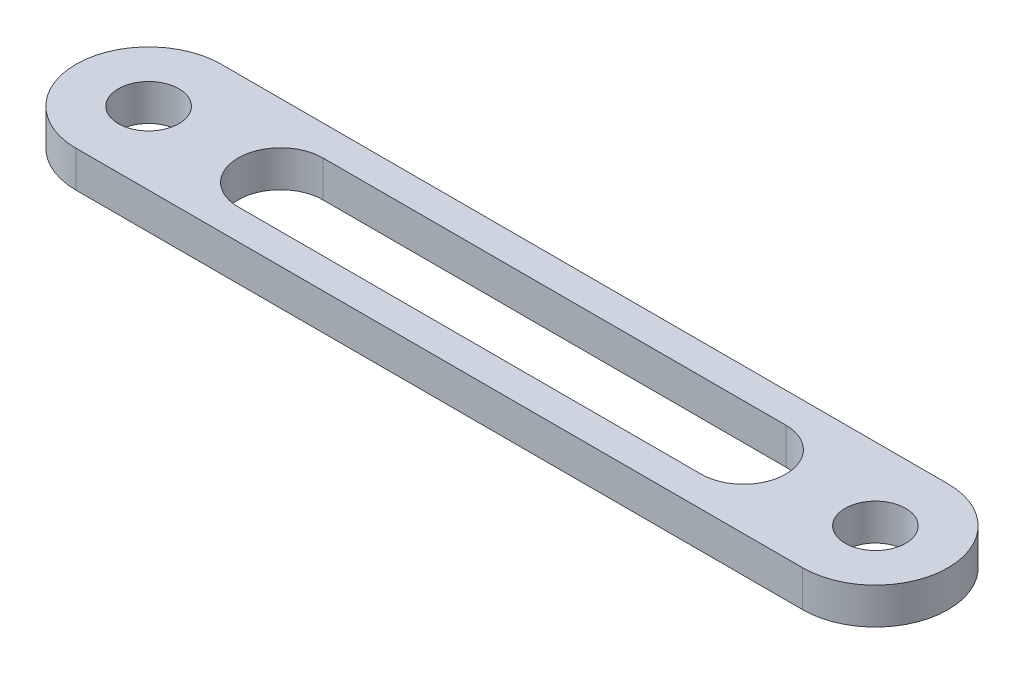
ISO-10303-21;
HEADER;
FILE_DESCRIPTION(('STEP AP214'),'2;1');
FILE_NAME('part.step','',(''),(''),'','','');
FILE_SCHEMA(('AUTOMOTIVE_DESIGN { 1 0 10303 214 1 1 1 1 }'));
ENDSEC;
DATA;
#1=APPLICATION_CONTEXT('core data for automotive mechanical design processes');
#2=APPLICATION_PROTOCOL_DEFINITION('international standard','automotive_design',2000,#1);
#3=PRODUCT_CONTEXT('',#1,'mechanical');
#4=PRODUCT('Part','Part','',(#3));
#5=PRODUCT_RELATED_PRODUCT_CATEGORY('part','',(#4));
#6=PRODUCT_DEFINITION_FORMATION('','',#4);
#7=PRODUCT_DEFINITION_CONTEXT('part definition',#1,'design');
#8=PRODUCT_DEFINITION('design','',#6,#7);
#9=PRODUCT_DEFINITION_SHAPE('','',#8);
#10=(LENGTH_UNIT() NAMED_UNIT(*) SI_UNIT(.MILLI.,.METRE.));
#11=(NAMED_UNIT(*) PLANE_ANGLE_UNIT() SI_UNIT($,.RADIAN.));
#12=(NAMED_UNIT(*) SI_UNIT($,.STERADIAN.) SOLID_ANGLE_UNIT());
#13=UNCERTAINTY_MEASURE_WITH_UNIT(LENGTH_MEASURE(1.E-05),#10,'distance_accuracy_value','');
#14=(GEOMETRIC_REPRESENTATION_CONTEXT(3) GLOBAL_UNCERTAINTY_ASSIGNED_CONTEXT((#13)) GLOBAL_UNIT_ASSIGNED_CONTEXT((#10,
#11,#12)) REPRESENTATION_CONTEXT('',''));
#15=CARTESIAN_POINT('',(0.,0.,0.));
#16=DIRECTION('',(0.,0.,1.));
#17=DIRECTION('',(1.,0.,0.));
#18=AXIS2_PLACEMENT_3D('',#15,#16,#17);
#19=CARTESIAN_POINT('',(38.1,3.81,0.));
#20=DIRECTION('',(0.,1.,0.));
#21=DIRECTION('',(0.,0.,1.));
#22=AXIS2_PLACEMENT_3D('',#19,#20,#21);
#23=PLANE('',#22);
#24=CARTESIAN_POINT('',(-38.1,3.81,0.));
#25=DIRECTION('',(0.,1.,0.));
#26=DIRECTION('',(0.,0.,1.));
#27=AXIS2_PLACEMENT_3D('',#24,#25,#26);
#28=CIRCLE('',#27,3.175);
#29=CARTESIAN_POINT('',(-38.1,3.81,-3.17499999999999));
#30=VERTEX_POINT('',#29);
#31=EDGE_CURVE('E170',#30,#30,#28,.T.);
#32=ORIENTED_EDGE('',*,*,#31,.F.);
#33=EDGE_LOOP('',(#32));
#34=FACE_BOUND('',#33,.T.);
#35=CARTESIAN_POINT('',(38.1,3.81,0.));
#36=DIRECTION('',(0.,1.,0.));
#37=DIRECTION('',(0.,0.,1.));
#38=AXIS2_PLACEMENT_3D('',#35,#36,#37);
#39=CIRCLE('',#38,7.62);
#40=CARTESIAN_POINT('',(38.1,3.81,7.61999999999998));
#41=VERTEX_POINT('',#40);
#42=CARTESIAN_POINT('',(38.1,3.81,-7.62000000000002));
#43=VERTEX_POINT('',#42);
#44=EDGE_CURVE('E174',#41,#43,#39,.T.);
#45=ORIENTED_EDGE('',*,*,#44,.T.);
#46=DIRECTION('',(-1.,0.,0.));
#47=VECTOR('',#46,1.);
#48=CARTESIAN_POINT('',(38.1,3.81,-7.62000000000002));
#49=LINE('',#48,#47);
#50=CARTESIAN_POINT('',(-38.1,3.81,-7.61999999999999));
#51=VERTEX_POINT('',#50);
#52=EDGE_CURVE('E177',#43,#51,#49,.T.);
#53=ORIENTED_EDGE('',*,*,#52,.T.);
#54=CARTESIAN_POINT('',(-38.1,3.81,0.));
#55=DIRECTION('',(0.,1.,0.));
#56=DIRECTION('',(0.,0.,1.));
#57=AXIS2_PLACEMENT_3D('',#54,#55,#56);
#58=CIRCLE('',#57,7.62);
#59=CARTESIAN_POINT('',(-38.1,3.81,7.62000000000001));
#60=VERTEX_POINT('',#59);
#61=EDGE_CURVE('E182',#51,#60,#58,.T.);
#62=ORIENTED_EDGE('',*,*,#61,.T.);
#63=DIRECTION('',(1.,0.,0.));
#64=VECTOR('',#63,1.);
#65=CARTESIAN_POINT('',(38.1,3.81,7.61999999999998));
#66=LINE('',#65,#64);
#67=EDGE_CURVE('E187',#60,#41,#66,.T.);
#68=ORIENTED_EDGE('',*,*,#67,.T.);
#69=EDGE_LOOP('',(#45,#53,#62,#68));
#70=FACE_BOUND('',#69,.T.);
#71=CARTESIAN_POINT('',(38.1,3.81,0.));
#72=DIRECTION('',(0.,1.,0.));
#73=DIRECTION('',(0.,0.,1.));
#74=AXIS2_PLACEMENT_3D('',#71,#72,#73);
#75=CIRCLE('',#74,3.175);
#76=CARTESIAN_POINT('',(38.1,3.81,-3.17500000000001));
#77=VERTEX_POINT('',#76);
#78=EDGE_CURVE('E158',#77,#77,#75,.T.);
#79=ORIENTED_EDGE('',*,*,#78,.F.);
#80=EDGE_LOOP('',(#79));
#81=FACE_BOUND('',#80,.T.);
#82=DIRECTION('',(1.,0.,0.));
#83=VECTOR('',#82,1.);
#84=CARTESIAN_POINT('',(-24.2668538232179,3.81,4.44500000000001));
#85=LINE('',#84,#83);
#86=CARTESIAN_POINT('',(-24.2668538232179,3.81,4.44500000000001));
#87=VERTEX_POINT('',#86);
#88=CARTESIAN_POINT('',(24.2668538232179,3.81,4.44499999999999));
#89=VERTEX_POINT('',#88);
#90=EDGE_CURVE('E119',#87,#89,#85,.T.);
#91=ORIENTED_EDGE('',*,*,#90,.F.);
#92=CARTESIAN_POINT('',(-24.2668538232179,3.81,0.));
#93=DIRECTION('',(0.,1.,0.));
#94=DIRECTION('',(0.,0.,1.));
#95=AXIS2_PLACEMENT_3D('',#92,#93,#94);
#96=CIRCLE('',#95,4.445);
#97=CARTESIAN_POINT('',(-24.2668538232179,3.81,-4.44499999999999));
#98=VERTEX_POINT('',#97);
#99=EDGE_CURVE('E111',#98,#87,#96,.T.);
#100=ORIENTED_EDGE('',*,*,#99,.F.);
#101=DIRECTION('',(-1.,0.,0.));
#102=VECTOR('',#101,1.);
#103=CARTESIAN_POINT('',(-24.2668538232179,3.81,-4.44499999999999));
#104=LINE('',#103,#102);
#105=CARTESIAN_POINT('',(24.2668538232179,3.81,-4.44500000000001));
#106=VERTEX_POINT('',#105);
#107=EDGE_CURVE('E140',#106,#98,#104,.T.);
#108=ORIENTED_EDGE('',*,*,#107,.F.);
#109=CARTESIAN_POINT('',(24.2668538232179,3.81,0.));
#110=DIRECTION('',(0.,1.,0.));
#111=DIRECTION('',(0.,0.,1.));
#112=AXIS2_PLACEMENT_3D('',#109,#110,#111);
#113=CIRCLE('',#112,4.445);
#114=EDGE_CURVE('E132',#89,#106,#113,.T.);
#115=ORIENTED_EDGE('',*,*,#114,.F.);
#116=EDGE_LOOP('',(#91,#100,#108,#115));
#117=FACE_BOUND('',#116,.T.);
#118=ADVANCED_FACE('F44',(#34,#70,#81,#117),#23,.T.);
#119=CARTESIAN_POINT('',(38.1,0.,0.));
#120=DIRECTION('',(0.,1.,0.));
#121=DIRECTION('',(0.,0.,1.));
#122=AXIS2_PLACEMENT_3D('',#119,#120,#121);
#123=PLANE('',#122);
#124=CARTESIAN_POINT('',(38.1,0.,0.));
#125=DIRECTION('',(0.,1.,0.));
#126=DIRECTION('',(0.,0.,1.));
#127=AXIS2_PLACEMENT_3D('',#124,#125,#126);
#128=CIRCLE('',#127,3.175);
#129=CARTESIAN_POINT('',(38.1,0.,-3.17500000000001));
#130=VERTEX_POINT('',#129);
#131=EDGE_CURVE('E126',#130,#130,#128,.T.);
#132=ORIENTED_EDGE('',*,*,#131,.T.);
#133=EDGE_LOOP('',(#132));
#134=FACE_BOUND('',#133,.T.);
#135=CARTESIAN_POINT('',(-38.1,0.,0.));
#136=DIRECTION('',(0.,1.,0.));
#137=DIRECTION('',(0.,0.,1.));
#138=AXIS2_PLACEMENT_3D('',#135,#136,#137);
#139=CIRCLE('',#138,3.175);
#140=CARTESIAN_POINT('',(-38.1,0.,-3.17499999999999));
#141=VERTEX_POINT('',#140);
#142=EDGE_CURVE('E161',#141,#141,#139,.T.);
#143=ORIENTED_EDGE('',*,*,#142,.T.);
#144=EDGE_LOOP('',(#143));
#145=FACE_BOUND('',#144,.T.);
#146=CARTESIAN_POINT('',(38.1,0.,0.));
#147=DIRECTION('',(0.,1.,0.));
#148=DIRECTION('',(0.,0.,1.));
#149=AXIS2_PLACEMENT_3D('',#146,#147,#148);
#150=CIRCLE('',#149,7.62);
#151=CARTESIAN_POINT('',(38.1,0.,7.61999999999998));
#152=VERTEX_POINT('',#151);
#153=CARTESIAN_POINT('',(38.1,0.,-7.62000000000002));
#154=VERTEX_POINT('',#153);
#155=EDGE_CURVE('E171',#152,#154,#150,.T.);
#156=ORIENTED_EDGE('',*,*,#155,.F.);
#157=DIRECTION('',(1.,0.,0.));
#158=VECTOR('',#157,1.);
#159=CARTESIAN_POINT('',(38.1,0.,7.61999999999998));
#160=LINE('',#159,#158);
#161=CARTESIAN_POINT('',(-38.1,0.,7.62000000000001));
#162=VERTEX_POINT('',#161);
#163=EDGE_CURVE('E179',#162,#152,#160,.T.);
#164=ORIENTED_EDGE('',*,*,#163,.F.);
#165=CARTESIAN_POINT('',(-38.1,0.,0.));
#166=DIRECTION('',(0.,1.,0.));
#167=DIRECTION('',(0.,0.,1.));
#168=AXIS2_PLACEMENT_3D('',#165,#166,#167);
#169=CIRCLE('',#168,7.62);
#170=CARTESIAN_POINT('',(-38.1,0.,-7.61999999999999));
#171=VERTEX_POINT('',#170);
#172=EDGE_CURVE('E198',#171,#162,#169,.T.);
#173=ORIENTED_EDGE('',*,*,#172,.F.);
#174=DIRECTION('',(-1.,0.,0.));
#175=VECTOR('',#174,1.);
#176=CARTESIAN_POINT('',(38.1,0.,-7.62000000000002));
#177=LINE('',#176,#175);
#178=EDGE_CURVE('E194',#154,#171,#177,.T.);
#179=ORIENTED_EDGE('',*,*,#178,.F.);
#180=EDGE_LOOP('',(#156,#164,#173,#179));
#181=FACE_BOUND('',#180,.T.);
#182=CARTESIAN_POINT('',(-24.2668538232179,0.,0.));
#183=DIRECTION('',(0.,1.,0.));
#184=DIRECTION('',(0.,0.,1.));
#185=AXIS2_PLACEMENT_3D('',#182,#183,#184);
#186=CIRCLE('',#185,4.445);
#187=CARTESIAN_POINT('',(-24.2668538232179,0.,-4.44499999999999));
#188=VERTEX_POINT('',#187);
#189=CARTESIAN_POINT('',(-24.2668538232179,0.,4.44500000000001));
#190=VERTEX_POINT('',#189);
#191=EDGE_CURVE('E70',#188,#190,#186,.T.);
#192=ORIENTED_EDGE('',*,*,#191,.T.);
#193=DIRECTION('',(1.,0.,0.));
#194=VECTOR('',#193,1.);
#195=CARTESIAN_POINT('',(-24.2668538232179,0.,4.44500000000001));
#196=LINE('',#195,#194);
#197=CARTESIAN_POINT('',(24.2668538232179,0.,4.44499999999999));
#198=VERTEX_POINT('',#197);
#199=EDGE_CURVE('E130',#190,#198,#196,.T.);
#200=ORIENTED_EDGE('',*,*,#199,.T.);
#201=CARTESIAN_POINT('',(24.2668538232179,0.,0.));
#202=DIRECTION('',(0.,1.,0.));
#203=DIRECTION('',(0.,0.,1.));
#204=AXIS2_PLACEMENT_3D('',#201,#202,#203);
#205=CIRCLE('',#204,4.445);
#206=CARTESIAN_POINT('',(24.2668538232179,0.,-4.44500000000001));
#207=VERTEX_POINT('',#206);
#208=EDGE_CURVE('E147',#198,#207,#205,.T.);
#209=ORIENTED_EDGE('',*,*,#208,.T.);
#210=DIRECTION('',(-1.,0.,0.));
#211=VECTOR('',#210,1.);
#212=CARTESIAN_POINT('',(-24.2668538232179,0.,-4.44499999999999));
#213=LINE('',#212,#211);
#214=EDGE_CURVE('E122',#207,#188,#213,.T.);
#215=ORIENTED_EDGE('',*,*,#214,.T.);
#216=EDGE_LOOP('',(#192,#200,#209,#215));
#217=FACE_BOUND('',#216,.T.);
#218=ADVANCED_FACE('F220',(#134,#145,#181,#217),#123,.F.);
#219=CARTESIAN_POINT('',(38.1,3.81,0.));
#220=DIRECTION('',(0.,-1.,0.));
#221=DIRECTION('',(0.,0.,-1.));
#222=AXIS2_PLACEMENT_3D('',#219,#220,#221);
#223=CYLINDRICAL_SURFACE('',#222,7.62);
#224=ORIENTED_EDGE('',*,*,#155,.T.);
#225=DIRECTION('',(0.,-1.,0.));
#226=VECTOR('',#225,1.);
#227=CARTESIAN_POINT('',(38.1,3.81,-7.62000000000002));
#228=LINE('',#227,#226);
#229=EDGE_CURVE('E11',#43,#154,#228,.T.);
#230=ORIENTED_EDGE('',*,*,#229,.F.);
#231=ORIENTED_EDGE('',*,*,#44,.F.);
#232=DIRECTION('',(0.,-1.,0.));
#233=VECTOR('',#232,1.);
#234=CARTESIAN_POINT('',(38.1,3.81,7.61999999999998));
#235=LINE('',#234,#233);
#236=EDGE_CURVE('E186',#41,#152,#235,.T.);
#237=ORIENTED_EDGE('',*,*,#236,.T.);
#238=EDGE_LOOP('',(#224,#230,#231,#237));
#239=FACE_BOUND('',#238,.T.);
#240=ADVANCED_FACE('F50',(#239),#223,.T.);
#241=CARTESIAN_POINT('',(38.1,3.81,-7.62000000000002));
#242=DIRECTION('',(0.,0.,1.));
#243=DIRECTION('',(1.,0.,0.));
#244=AXIS2_PLACEMENT_3D('',#241,#242,#243);
#245=PLANE('',#244);
#246=ORIENTED_EDGE('',*,*,#178,.T.);
#247=DIRECTION('',(0.,-1.,0.));
#248=VECTOR('',#247,1.);
#249=CARTESIAN_POINT('',(-38.1,3.81,-7.61999999999999));
#250=LINE('',#249,#248);
#251=EDGE_CURVE('E53',#51,#171,#250,.T.);
#252=ORIENTED_EDGE('',*,*,#251,.F.);
#253=ORIENTED_EDGE('',*,*,#52,.F.);
#254=ORIENTED_EDGE('',*,*,#229,.T.);
#255=EDGE_LOOP('',(#246,#252,#253,#254));
#256=FACE_BOUND('',#255,.T.);
#257=ADVANCED_FACE('F229',(#256),#245,.F.);
#258=CARTESIAN_POINT('',(-38.1,3.81,0.));
#259=DIRECTION('',(0.,-1.,0.));
#260=DIRECTION('',(0.,0.,-1.));
#261=AXIS2_PLACEMENT_3D('',#258,#259,#260);
#262=CYLINDRICAL_SURFACE('',#261,7.62);
#263=ORIENTED_EDGE('',*,*,#172,.T.);
#264=DIRECTION('',(0.,-1.,0.));
#265=VECTOR('',#264,1.);
#266=CARTESIAN_POINT('',(-38.1,3.81,7.62000000000001));
#267=LINE('',#266,#265);
#268=EDGE_CURVE('E203',#60,#162,#267,.T.);
#269=ORIENTED_EDGE('',*,*,#268,.F.);
#270=ORIENTED_EDGE('',*,*,#61,.F.);
#271=ORIENTED_EDGE('',*,*,#251,.T.);
#272=EDGE_LOOP('',(#263,#269,#270,#271));
#273=FACE_BOUND('',#272,.T.);
#274=ADVANCED_FACE('F214',(#273),#262,.T.);
#275=CARTESIAN_POINT('',(38.1,3.81,7.61999999999998));
#276=DIRECTION('',(0.,0.,-1.));
#277=DIRECTION('',(-1.,0.,0.));
#278=AXIS2_PLACEMENT_3D('',#275,#276,#277);
#279=PLANE('',#278);
#280=ORIENTED_EDGE('',*,*,#163,.T.);
#281=ORIENTED_EDGE('',*,*,#236,.F.);
#282=ORIENTED_EDGE('',*,*,#67,.F.);
#283=ORIENTED_EDGE('',*,*,#268,.T.);
#284=EDGE_LOOP('',(#280,#281,#282,#283));
#285=FACE_BOUND('',#284,.T.);
#286=ADVANCED_FACE('F222',(#285),#279,.F.);
#287=CARTESIAN_POINT('',(-38.1,3.81,0.));
#288=DIRECTION('',(0.,-1.,0.));
#289=DIRECTION('',(0.,0.,-1.));
#290=AXIS2_PLACEMENT_3D('',#287,#288,#289);
#291=CYLINDRICAL_SURFACE('',#290,3.175);
#292=CARTESIAN_POINT('',(-38.1,3.81,-3.17499999999999));
#293=CARTESIAN_POINT('',(-38.1,3.7703125,-3.17499999999999));
#294=CARTESIAN_POINT('',(-38.1,3.730625,-3.17499999999999));
#295=CARTESIAN_POINT('',(-38.1,3.65125,-3.17499999999999));
#296=CARTESIAN_POINT('',(-38.1,3.6115625,-3.17499999999999));
#297=CARTESIAN_POINT('',(-38.1,3.5321875,-3.17499999999999));
#298=CARTESIAN_POINT('',(-38.1,3.4925,-3.17499999999999));
#299=CARTESIAN_POINT('',(-38.1,3.413125,-3.17499999999999));
#300=CARTESIAN_POINT('',(-38.1,3.3734375,-3.17499999999999));
#301=CARTESIAN_POINT('',(-38.1,3.2940625,-3.17499999999999));
#302=CARTESIAN_POINT('',(-38.1,3.254375,-3.17499999999999));
#303=CARTESIAN_POINT('',(-38.1,3.175,-3.17499999999999));
#304=CARTESIAN_POINT('',(-38.1,3.1353125,-3.17499999999999));
#305=CARTESIAN_POINT('',(-38.1,3.0559375,-3.17499999999999));
#306=CARTESIAN_POINT('',(-38.1,3.01625,-3.17499999999999));
#307=CARTESIAN_POINT('',(-38.1,2.936875,-3.17499999999999));
#308=CARTESIAN_POINT('',(-38.1,2.8971875,-3.17499999999999));
#309=CARTESIAN_POINT('',(-38.1,2.8178125,-3.17499999999999));
#310=CARTESIAN_POINT('',(-38.1,2.778125,-3.17499999999999));
#311=CARTESIAN_POINT('',(-38.1,2.69875,-3.17499999999999));
#312=CARTESIAN_POINT('',(-38.1,2.6590625,-3.17499999999999));
#313=CARTESIAN_POINT('',(-38.1,2.5796875,-3.17499999999999));
#314=CARTESIAN_POINT('',(-38.1,2.54,-3.17499999999999));
#315=CARTESIAN_POINT('',(-38.1,2.460625,-3.17499999999999));
#316=CARTESIAN_POINT('',(-38.1,2.4209375,-3.17499999999999));
#317=CARTESIAN_POINT('',(-38.1,2.3415625,-3.17499999999999));
#318=CARTESIAN_POINT('',(-38.1,2.301875,-3.17499999999999));
#319=CARTESIAN_POINT('',(-38.1,2.2225,-3.17499999999999));
#320=CARTESIAN_POINT('',(-38.1,2.1828125,-3.17499999999999));
#321=CARTESIAN_POINT('',(-38.1,2.1034375,-3.17499999999999));
#322=CARTESIAN_POINT('',(-38.1,2.06375,-3.17499999999999));
#323=CARTESIAN_POINT('',(-38.1,1.984375,-3.17499999999999));
#324=CARTESIAN_POINT('',(-38.1,1.9446875,-3.17499999999999));
#325=CARTESIAN_POINT('',(-38.1,1.8653125,-3.17499999999999));
#326=CARTESIAN_POINT('',(-38.1,1.825625,-3.17499999999999));
#327=CARTESIAN_POINT('',(-38.1,1.74625,-3.17499999999999));
#328=CARTESIAN_POINT('',(-38.1,1.7065625,-3.17499999999999));
#329=CARTESIAN_POINT('',(-38.1,1.6271875,-3.17499999999999));
#330=CARTESIAN_POINT('',(-38.1,1.5875,-3.17499999999999));
#331=CARTESIAN_POINT('',(-38.1,1.508125,-3.17499999999999));
#332=CARTESIAN_POINT('',(-38.1,1.4684375,-3.17499999999999));
#333=CARTESIAN_POINT('',(-38.1,1.3890625,-3.17499999999999));
#334=CARTESIAN_POINT('',(-38.1,1.349375,-3.17499999999999));
#335=CARTESIAN_POINT('',(-38.1,1.27,-3.17499999999999));
#336=CARTESIAN_POINT('',(-38.1,1.2303125,-3.17499999999999));
#337=CARTESIAN_POINT('',(-38.1,1.1509375,-3.17499999999999));
#338=CARTESIAN_POINT('',(-38.1,1.11125,-3.17499999999999));
#339=CARTESIAN_POINT('',(-38.1,1.031875,-3.17499999999999));
#340=CARTESIAN_POINT('',(-38.1,0.9921875,-3.17499999999999));
#341=CARTESIAN_POINT('',(-38.1,0.9128125,-3.17499999999999));
#342=CARTESIAN_POINT('',(-38.1,0.873125,-3.17499999999999));
#343=CARTESIAN_POINT('',(-38.1,0.79375,-3.17499999999999));
#344=CARTESIAN_POINT('',(-38.1,0.7540625,-3.17499999999999));
#345=CARTESIAN_POINT('',(-38.1,0.6746875,-3.17499999999999));
#346=CARTESIAN_POINT('',(-38.1,0.635,-3.17499999999999));
#347=CARTESIAN_POINT('',(-38.1,0.555625,-3.17499999999999));
#348=CARTESIAN_POINT('',(-38.1,0.5159375,-3.17499999999999));
#349=CARTESIAN_POINT('',(-38.1,0.4365625,-3.17499999999999));
#350=CARTESIAN_POINT('',(-38.1,0.396875,-3.17499999999999));
#351=CARTESIAN_POINT('',(-38.1,0.3175,-3.17499999999999));
#352=CARTESIAN_POINT('',(-38.1,0.2778125,-3.17499999999999));
#353=CARTESIAN_POINT('',(-38.1,0.1984375,-3.17499999999999));
#354=CARTESIAN_POINT('',(-38.1,0.15875,-3.17499999999999));
#355=CARTESIAN_POINT('',(-38.1,0.0793749999999999,-3.17499999999999));
#356=CARTESIAN_POINT('',(-38.1,0.0396874999999999,-3.17499999999999));
#357=CARTESIAN_POINT('',(-38.1,0.,-3.17499999999999));
#358=B_SPLINE_CURVE_WITH_KNOTS('',3,(#292,#293,#294,#295,#296,#297,#298,#299,#300,#301,#302,
#303,#304,#305,#306,#307,#308,#309,#310,#311,#312,#313,#314,#315,#316,#317,#318,#319,#320,#321,
#322,#323,#324,#325,#326,#327,#328,#329,#330,#331,#332,#333,#334,#335,#336,#337,#338,#339,#340,
#341,#342,#343,#344,#345,#346,#347,#348,#349,#350,#351,#352,#353,#354,#355,#356,#357),
.UNSPECIFIED.,.F.,.F.,(4,2,2,2,2,2,2,2,2,2,2,2,2,2,2,2,2,2,2,2,2,2,2,2,2,2,2,2,2,2,2,2,4),(0.,
0.1190625,0.238125,0.3571875,0.47625,0.595312499999999,0.714375,0.833437499999999,
0.952499999999999,1.0715625,1.190625,1.3096875,1.42875,1.5478125,1.666875,1.7859375,1.905,
2.0240625,2.143125,2.2621875,2.38125,2.5003125,2.619375,2.7384375,2.8575,2.9765625,3.095625,
3.2146875,3.33375,3.4528125,3.571875,3.6909375,3.81),.UNSPECIFIED.);
#359=EDGE_CURVE('BSEAM250',#30,#141,#358,.T.);
#360=ORIENTED_EDGE('',*,*,#31,.T.);
#361=ORIENTED_EDGE('',*,*,#142,.F.);
#362=ORIENTED_EDGE('',*,*,#359,.T.);
#363=ORIENTED_EDGE('',*,*,#359,.F.);
#364=EDGE_LOOP('',(#360,#362,#361,#363));
#365=FACE_BOUND('',#364,.T.);
#366=ADVANCED_FACE('F250',(#365),#291,.F.);
#367=CARTESIAN_POINT('',(38.1,3.81,0.));
#368=DIRECTION('',(0.,-1.,0.));
#369=DIRECTION('',(0.,0.,-1.));
#370=AXIS2_PLACEMENT_3D('',#367,#368,#369);
#371=CYLINDRICAL_SURFACE('',#370,3.175);
#372=CARTESIAN_POINT('',(38.1,3.81,-3.17500000000001));
#373=CARTESIAN_POINT('',(38.1,3.7703125,-3.17500000000001));
#374=CARTESIAN_POINT('',(38.1,3.730625,-3.17500000000001));
#375=CARTESIAN_POINT('',(38.1,3.65125,-3.17500000000001));
#376=CARTESIAN_POINT('',(38.1,3.6115625,-3.17500000000001));
#377=CARTESIAN_POINT('',(38.1,3.5321875,-3.17500000000001));
#378=CARTESIAN_POINT('',(38.1,3.4925,-3.17500000000001));
#379=CARTESIAN_POINT('',(38.1,3.413125,-3.17500000000001));
#380=CARTESIAN_POINT('',(38.1,3.3734375,-3.17500000000001));
#381=CARTESIAN_POINT('',(38.1,3.2940625,-3.17500000000001));
#382=CARTESIAN_POINT('',(38.1,3.254375,-3.17500000000001));
#383=CARTESIAN_POINT('',(38.1,3.175,-3.17500000000001));
#384=CARTESIAN_POINT('',(38.1,3.1353125,-3.17500000000001));
#385=CARTESIAN_POINT('',(38.1,3.0559375,-3.17500000000001));
#386=CARTESIAN_POINT('',(38.1,3.01625,-3.17500000000001));
#387=CARTESIAN_POINT('',(38.1,2.936875,-3.17500000000001));
#388=CARTESIAN_POINT('',(38.1,2.8971875,-3.17500000000001));
#389=CARTESIAN_POINT('',(38.1,2.8178125,-3.17500000000001));
#390=CARTESIAN_POINT('',(38.1,2.778125,-3.17500000000001));
#391=CARTESIAN_POINT('',(38.1,2.69875,-3.17500000000001));
#392=CARTESIAN_POINT('',(38.1,2.6590625,-3.17500000000001));
#393=CARTESIAN_POINT('',(38.1,2.5796875,-3.17500000000001));
#394=CARTESIAN_POINT('',(38.1,2.54,-3.17500000000001));
#395=CARTESIAN_POINT('',(38.1,2.460625,-3.17500000000001));
#396=CARTESIAN_POINT('',(38.1,2.4209375,-3.17500000000001));
#397=CARTESIAN_POINT('',(38.1,2.3415625,-3.17500000000001));
#398=CARTESIAN_POINT('',(38.1,2.301875,-3.17500000000001));
#399=CARTESIAN_POINT('',(38.1,2.2225,-3.17500000000001));
#400=CARTESIAN_POINT('',(38.1,2.1828125,-3.17500000000001));
#401=CARTESIAN_POINT('',(38.1,2.1034375,-3.17500000000001));
#402=CARTESIAN_POINT('',(38.1,2.06375,-3.17500000000001));
#403=CARTESIAN_POINT('',(38.1,1.984375,-3.17500000000001));
#404=CARTESIAN_POINT('',(38.1,1.9446875,-3.17500000000001));
#405=CARTESIAN_POINT('',(38.1,1.8653125,-3.17500000000001));
#406=CARTESIAN_POINT('',(38.1,1.825625,-3.17500000000001));
#407=CARTESIAN_POINT('',(38.1,1.74625,-3.17500000000001));
#408=CARTESIAN_POINT('',(38.1,1.7065625,-3.17500000000001));
#409=CARTESIAN_POINT('',(38.1,1.6271875,-3.17500000000001));
#410=CARTESIAN_POINT('',(38.1,1.5875,-3.17500000000001));
#411=CARTESIAN_POINT('',(38.1,1.508125,-3.17500000000001));
#412=CARTESIAN_POINT('',(38.1,1.4684375,-3.17500000000001));
#413=CARTESIAN_POINT('',(38.1,1.3890625,-3.17500000000001));
#414=CARTESIAN_POINT('',(38.1,1.349375,-3.17500000000001));
#415=CARTESIAN_POINT('',(38.1,1.27,-3.17500000000001));
#416=CARTESIAN_POINT('',(38.1,1.2303125,-3.17500000000001));
#417=CARTESIAN_POINT('',(38.1,1.1509375,-3.17500000000001));
#418=CARTESIAN_POINT('',(38.1,1.11125,-3.17500000000001));
#419=CARTESIAN_POINT('',(38.1,1.031875,-3.17500000000001));
#420=CARTESIAN_POINT('',(38.1,0.9921875,-3.17500000000001));
#421=CARTESIAN_POINT('',(38.1,0.9128125,-3.17500000000001));
#422=CARTESIAN_POINT('',(38.1,0.873125,-3.17500000000001));
#423=CARTESIAN_POINT('',(38.1,0.79375,-3.17500000000001));
#424=CARTESIAN_POINT('',(38.1,0.7540625,-3.17500000000001));
#425=CARTESIAN_POINT('',(38.1,0.6746875,-3.17500000000001));
#426=CARTESIAN_POINT('',(38.1,0.635,-3.17500000000001));
#427=CARTESIAN_POINT('',(38.1,0.555625,-3.17500000000001));
#428=CARTESIAN_POINT('',(38.1,0.5159375,-3.17500000000001));
#429=CARTESIAN_POINT('',(38.1,0.4365625,-3.17500000000001));
#430=CARTESIAN_POINT('',(38.1,0.396875,-3.17500000000001));
#431=CARTESIAN_POINT('',(38.1,0.3175,-3.17500000000001));
#432=CARTESIAN_POINT('',(38.1,0.2778125,-3.17500000000001));
#433=CARTESIAN_POINT('',(38.1,0.1984375,-3.17500000000001));
#434=CARTESIAN_POINT('',(38.1,0.15875,-3.17500000000001));
#435=CARTESIAN_POINT('',(38.1,0.0793749999999999,-3.17500000000001));
#436=CARTESIAN_POINT('',(38.1,0.0396874999999999,-3.17500000000001));
#437=CARTESIAN_POINT('',(38.1,0.,-3.17500000000001));
#438=B_SPLINE_CURVE_WITH_KNOTS('',3,(#372,#373,#374,#375,#376,#377,#378,#379,#380,#381,#382,
#383,#384,#385,#386,#387,#388,#389,#390,#391,#392,#393,#394,#395,#396,#397,#398,#399,#400,#401,
#402,#403,#404,#405,#406,#407,#408,#409,#410,#411,#412,#413,#414,#415,#416,#417,#418,#419,#420,
#421,#422,#423,#424,#425,#426,#427,#428,#429,#430,#431,#432,#433,#434,#435,#436,#437),
.UNSPECIFIED.,.F.,.F.,(4,2,2,2,2,2,2,2,2,2,2,2,2,2,2,2,2,2,2,2,2,2,2,2,2,2,2,2,2,2,2,2,4),(0.,
0.1190625,0.238125,0.3571875,0.47625,0.595312499999999,0.714375,0.833437499999999,
0.952499999999999,1.0715625,1.190625,1.3096875,1.42875,1.5478125,1.666875,1.7859375,1.905,
2.0240625,2.143125,2.2621875,2.38125,2.5003125,2.619375,2.7384375,2.8575,2.9765625,3.095625,
3.2146875,3.33375,3.4528125,3.571875,3.6909375,3.81),.UNSPECIFIED.);
#439=EDGE_CURVE('BSEAM251',#77,#130,#438,.T.);
#440=ORIENTED_EDGE('',*,*,#78,.T.);
#441=ORIENTED_EDGE('',*,*,#131,.F.);
#442=ORIENTED_EDGE('',*,*,#439,.T.);
#443=ORIENTED_EDGE('',*,*,#439,.F.);
#444=EDGE_LOOP('',(#440,#442,#441,#443));
#445=FACE_BOUND('',#444,.T.);
#446=ADVANCED_FACE('F251',(#445),#371,.F.);
#447=CARTESIAN_POINT('',(-24.2668538232179,3.81,0.));
#448=DIRECTION('',(0.,-1.,0.));
#449=DIRECTION('',(0.,0.,-1.));
#450=AXIS2_PLACEMENT_3D('',#447,#448,#449);
#451=CYLINDRICAL_SURFACE('',#450,4.445);
#452=ORIENTED_EDGE('',*,*,#191,.F.);
#453=DIRECTION('',(0.,-1.,0.));
#454=VECTOR('',#453,1.);
#455=CARTESIAN_POINT('',(-24.2668538232179,3.81,-4.44499999999999));
#456=LINE('',#455,#454);
#457=EDGE_CURVE('E114',#98,#188,#456,.T.);
#458=ORIENTED_EDGE('',*,*,#457,.F.);
#459=ORIENTED_EDGE('',*,*,#99,.T.);
#460=DIRECTION('',(0.,-1.,0.));
#461=VECTOR('',#460,1.);
#462=CARTESIAN_POINT('',(-24.2668538232179,3.81,4.44500000000001));
#463=LINE('',#462,#461);
#464=EDGE_CURVE('E112',#87,#190,#463,.T.);
#465=ORIENTED_EDGE('',*,*,#464,.T.);
#466=EDGE_LOOP('',(#452,#458,#459,#465));
#467=FACE_BOUND('',#466,.T.);
#468=ADVANCED_FACE('F113',(#467),#451,.F.);
#469=CARTESIAN_POINT('',(-24.2668538232179,3.81,4.44500000000001));
#470=DIRECTION('',(0.,0.,-1.));
#471=DIRECTION('',(-1.,0.,0.));
#472=AXIS2_PLACEMENT_3D('',#469,#470,#471);
#473=PLANE('',#472);
#474=ORIENTED_EDGE('',*,*,#199,.F.);
#475=ORIENTED_EDGE('',*,*,#464,.F.);
#476=ORIENTED_EDGE('',*,*,#90,.T.);
#477=DIRECTION('',(0.,-1.,0.));
#478=VECTOR('',#477,1.);
#479=CARTESIAN_POINT('',(24.2668538232179,3.81,4.44499999999999));
#480=LINE('',#479,#478);
#481=EDGE_CURVE('E128',#89,#198,#480,.T.);
#482=ORIENTED_EDGE('',*,*,#481,.T.);
#483=EDGE_LOOP('',(#474,#475,#476,#482));
#484=FACE_BOUND('',#483,.T.);
#485=ADVANCED_FACE('F121',(#484),#473,.T.);
#486=CARTESIAN_POINT('',(24.2668538232179,3.81,0.));
#487=DIRECTION('',(0.,-1.,0.));
#488=DIRECTION('',(0.,0.,-1.));
#489=AXIS2_PLACEMENT_3D('',#486,#487,#488);
#490=CYLINDRICAL_SURFACE('',#489,4.445);
#491=ORIENTED_EDGE('',*,*,#208,.F.);
#492=ORIENTED_EDGE('',*,*,#481,.F.);
#493=ORIENTED_EDGE('',*,*,#114,.T.);
#494=DIRECTION('',(0.,-1.,0.));
#495=VECTOR('',#494,1.);
#496=CARTESIAN_POINT('',(24.2668538232179,3.81,-4.44500000000001));
#497=LINE('',#496,#495);
#498=EDGE_CURVE('E62',#106,#207,#497,.T.);
#499=ORIENTED_EDGE('',*,*,#498,.T.);
#500=EDGE_LOOP('',(#491,#492,#493,#499));
#501=FACE_BOUND('',#500,.T.);
#502=ADVANCED_FACE('F272',(#501),#490,.F.);
#503=CARTESIAN_POINT('',(-24.2668538232179,3.81,-4.44499999999999));
#504=DIRECTION('',(0.,0.,1.));
#505=DIRECTION('',(1.,0.,0.));
#506=AXIS2_PLACEMENT_3D('',#503,#504,#505);
#507=PLANE('',#506);
#508=ORIENTED_EDGE('',*,*,#214,.F.);
#509=ORIENTED_EDGE('',*,*,#498,.F.);
#510=ORIENTED_EDGE('',*,*,#107,.T.);
#511=ORIENTED_EDGE('',*,*,#457,.T.);
#512=EDGE_LOOP('',(#508,#509,#510,#511));
#513=FACE_BOUND('',#512,.T.);
#514=ADVANCED_FACE('F274',(#513),#507,.T.);
#515=CLOSED_SHELL('',(#118,#218,#240,#257,#274,#286,#366,#446,#468,#485,#502,#514));
#516=MANIFOLD_SOLID_BREP('B2',#515);
#517=ADVANCED_BREP_SHAPE_REPRESENTATION('',(#18,#516),#14);
#518=SHAPE_DEFINITION_REPRESENTATION(#9,#517);
ENDSEC;
END-ISO-10303-21;
